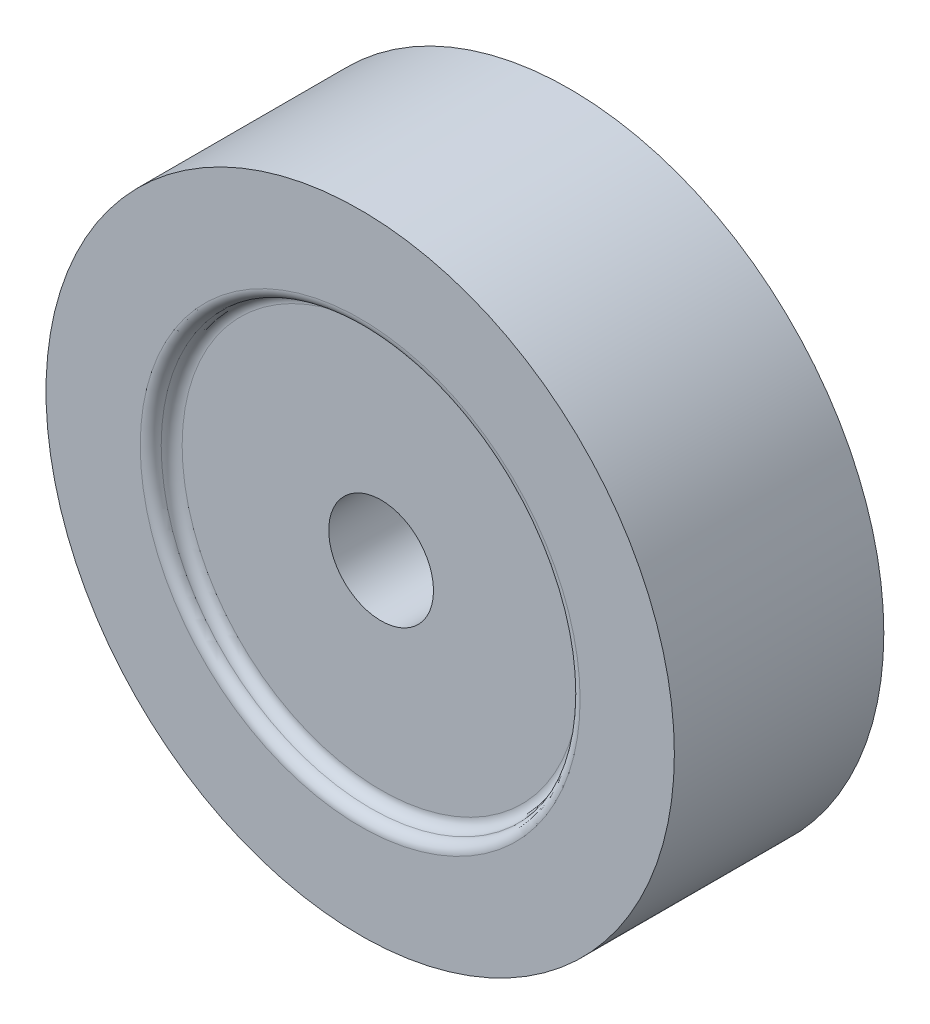
ISO-10303-21;
HEADER;
FILE_DESCRIPTION(('STEP AP214'),'2;1');
FILE_NAME('part.step','',(''),(''),'','','');
FILE_SCHEMA(('AUTOMOTIVE_DESIGN { 1 0 10303 214 1 1 1 1 }'));
ENDSEC;
DATA;
#1=APPLICATION_CONTEXT('core data for automotive mechanical design processes');
#2=APPLICATION_PROTOCOL_DEFINITION('international standard','automotive_design',2000,#1);
#3=PRODUCT_CONTEXT('',#1,'mechanical');
#4=PRODUCT('Part','Part','',(#3));
#5=PRODUCT_RELATED_PRODUCT_CATEGORY('part','',(#4));
#6=PRODUCT_DEFINITION_FORMATION('','',#4);
#7=PRODUCT_DEFINITION_CONTEXT('part definition',#1,'design');
#8=PRODUCT_DEFINITION('design','',#6,#7);
#9=PRODUCT_DEFINITION_SHAPE('','',#8);
#10=(LENGTH_UNIT() NAMED_UNIT(*) SI_UNIT(.MILLI.,.METRE.));
#11=(NAMED_UNIT(*) PLANE_ANGLE_UNIT() SI_UNIT($,.RADIAN.));
#12=(NAMED_UNIT(*) SI_UNIT($,.STERADIAN.) SOLID_ANGLE_UNIT());
#13=UNCERTAINTY_MEASURE_WITH_UNIT(LENGTH_MEASURE(1.E-05),#10,'distance_accuracy_value','');
#14=(GEOMETRIC_REPRESENTATION_CONTEXT(3) GLOBAL_UNCERTAINTY_ASSIGNED_CONTEXT((#13)) GLOBAL_UNIT_ASSIGNED_CONTEXT((#10,
#11,#12)) REPRESENTATION_CONTEXT('',''));
#15=CARTESIAN_POINT('',(0.,0.,0.));
#16=DIRECTION('',(0.,0.,1.));
#17=DIRECTION('',(1.,0.,0.));
#18=AXIS2_PLACEMENT_3D('',#15,#16,#17);
#19=CARTESIAN_POINT('',(0.,0.,10.));
#20=DIRECTION('',(0.,0.,-1.));
#21=DIRECTION('',(-1.,0.,0.));
#22=AXIS2_PLACEMENT_3D('',#19,#20,#21);
#23=CYLINDRICAL_SURFACE('',#22,30.);
#24=CARTESIAN_POINT('',(0.,0.,10.));
#25=DIRECTION('',(0.,0.,1.));
#26=DIRECTION('',(1.,0.,0.));
#27=AXIS2_PLACEMENT_3D('',#24,#25,#26);
#28=CIRCLE('',#27,30.);
#29=CARTESIAN_POINT('',(30.,0.,10.));
#30=VERTEX_POINT('',#29);
#31=EDGE_CURVE('E54',#30,#30,#28,.T.);
#32=ORIENTED_EDGE('',*,*,#31,.F.);
#33=EDGE_LOOP('',(#32));
#34=FACE_BOUND('',#33,.T.);
#35=CARTESIAN_POINT('',(0.,0.,-10.));
#36=DIRECTION('',(0.,0.,1.));
#37=DIRECTION('',(1.,0.,0.));
#38=AXIS2_PLACEMENT_3D('',#35,#36,#37);
#39=CIRCLE('',#38,30.);
#40=CARTESIAN_POINT('',(30.,0.,-10.));
#41=VERTEX_POINT('',#40);
#42=EDGE_CURVE('E50',#41,#41,#39,.T.);
#43=ORIENTED_EDGE('',*,*,#42,.T.);
#44=EDGE_LOOP('',(#43));
#45=FACE_BOUND('',#44,.T.);
#46=ADVANCED_FACE('F32',(#34,#45),#23,.T.);
#47=CARTESIAN_POINT('',(0.,0.,10.));
#48=DIRECTION('',(0.,0.,1.));
#49=DIRECTION('',(1.,0.,0.));
#50=AXIS2_PLACEMENT_3D('',#47,#48,#49);
#51=PLANE('',#50);
#52=CARTESIAN_POINT('',(0.,0.,10.));
#53=DIRECTION('',(0.,0.,1.));
#54=DIRECTION('',(1.,0.,0.));
#55=AXIS2_PLACEMENT_3D('',#52,#53,#54);
#56=CIRCLE('',#55,21.);
#57=CARTESIAN_POINT('',(21.,0.,10.));
#58=VERTEX_POINT('',#57);
#59=EDGE_CURVE('E45',#58,#58,#56,.F.);
#60=ORIENTED_EDGE('',*,*,#59,.T.);
#61=EDGE_LOOP('',(#60));
#62=FACE_BOUND('',#61,.T.);
#63=ORIENTED_EDGE('',*,*,#31,.T.);
#64=EDGE_LOOP('',(#63));
#65=FACE_BOUND('',#64,.T.);
#66=ADVANCED_FACE('F75',(#62,#65),#51,.T.);
#67=CARTESIAN_POINT('',(0.,0.,-10.));
#68=DIRECTION('',(0.,0.,1.));
#69=DIRECTION('',(1.,0.,0.));
#70=AXIS2_PLACEMENT_3D('',#67,#68,#69);
#71=PLANE('',#70);
#72=CARTESIAN_POINT('',(0.,0.,-10.));
#73=DIRECTION('',(0.,0.,1.));
#74=DIRECTION('',(1.,0.,0.));
#75=AXIS2_PLACEMENT_3D('',#72,#73,#74);
#76=CIRCLE('',#75,21.);
#77=CARTESIAN_POINT('',(21.,0.,-10.));
#78=VERTEX_POINT('',#77);
#79=EDGE_CURVE('E10',#78,#78,#76,.T.);
#80=ORIENTED_EDGE('',*,*,#79,.T.);
#81=EDGE_LOOP('',(#80));
#82=FACE_BOUND('',#81,.T.);
#83=ORIENTED_EDGE('',*,*,#42,.F.);
#84=EDGE_LOOP('',(#83));
#85=FACE_BOUND('',#84,.T.);
#86=ADVANCED_FACE('F98',(#82,#85),#71,.F.);
#87=CARTESIAN_POINT('',(0.,0.,8.));
#88=DIRECTION('',(0.,0.,1.));
#89=DIRECTION('',(1.,0.,0.));
#90=AXIS2_PLACEMENT_3D('',#87,#88,#89);
#91=PLANE('',#90);
#92=CARTESIAN_POINT('',(0.,0.,8.));
#93=DIRECTION('',(0.,0.,1.));
#94=DIRECTION('',(1.,0.,0.));
#95=AXIS2_PLACEMENT_3D('',#92,#93,#94);
#96=CIRCLE('',#95,5.);
#97=CARTESIAN_POINT('',(5.,0.,8.));
#98=VERTEX_POINT('',#97);
#99=EDGE_CURVE('E57',#98,#98,#96,.T.);
#100=ORIENTED_EDGE('',*,*,#99,.F.);
#101=EDGE_LOOP('',(#100));
#102=FACE_BOUND('',#101,.T.);
#103=CARTESIAN_POINT('',(0.,0.,8.));
#104=DIRECTION('',(0.,0.,1.));
#105=DIRECTION('',(1.,0.,0.));
#106=AXIS2_PLACEMENT_3D('',#103,#104,#105);
#107=CIRCLE('',#106,19.);
#108=CARTESIAN_POINT('',(19.,0.,8.));
#109=VERTEX_POINT('',#108);
#110=EDGE_CURVE('E69',#109,#109,#107,.T.);
#111=ORIENTED_EDGE('',*,*,#110,.T.);
#112=EDGE_LOOP('',(#111));
#113=FACE_BOUND('',#112,.T.);
#114=ADVANCED_FACE('F89',(#102,#113),#91,.T.);
#115=CARTESIAN_POINT('',(0.,0.,-8.));
#116=DIRECTION('',(0.,0.,-1.));
#117=DIRECTION('',(1.,0.,0.));
#118=AXIS2_PLACEMENT_3D('',#115,#116,#117);
#119=PLANE('',#118);
#120=CARTESIAN_POINT('',(0.,0.,-8.));
#121=DIRECTION('',(0.,0.,-1.));
#122=DIRECTION('',(-1.,0.,0.));
#123=AXIS2_PLACEMENT_3D('',#120,#121,#122);
#124=CIRCLE('',#123,5.);
#125=CARTESIAN_POINT('',(-5.,0.,-8.));
#126=VERTEX_POINT('',#125);
#127=EDGE_CURVE('E61',#126,#126,#124,.F.);
#128=ORIENTED_EDGE('',*,*,#127,.T.);
#129=EDGE_LOOP('',(#128));
#130=FACE_BOUND('',#129,.T.);
#131=CARTESIAN_POINT('',(0.,0.,-8.));
#132=DIRECTION('',(0.,0.,-1.));
#133=DIRECTION('',(-1.,0.,0.));
#134=AXIS2_PLACEMENT_3D('',#131,#132,#133);
#135=CIRCLE('',#134,19.);
#136=CARTESIAN_POINT('',(-19.,0.,-8.));
#137=VERTEX_POINT('',#136);
#138=EDGE_CURVE('E40',#137,#137,#135,.T.);
#139=ORIENTED_EDGE('',*,*,#138,.T.);
#140=EDGE_LOOP('',(#139));
#141=FACE_BOUND('',#140,.T.);
#142=ADVANCED_FACE('F82',(#130,#141),#119,.T.);
#143=CARTESIAN_POINT('',(0.,0.,9.));
#144=DIRECTION('',(0.,0.,1.));
#145=DIRECTION('',(1.,0.,0.));
#146=AXIS2_PLACEMENT_3D('',#143,#144,#145);
#147=TOROIDAL_SURFACE('',#146,21.,1.);
#148=ORIENTED_EDGE('',*,*,#59,.F.);
#149=EDGE_LOOP('',(#148));
#150=FACE_BOUND('',#149,.T.);
#151=CARTESIAN_POINT('',(0.,0.,9.));
#152=DIRECTION('',(0.,0.,1.));
#153=DIRECTION('',(1.,0.,0.));
#154=AXIS2_PLACEMENT_3D('',#151,#152,#153);
#155=CIRCLE('',#154,20.);
#156=CARTESIAN_POINT('',(20.,0.,9.));
#157=VERTEX_POINT('',#156);
#158=EDGE_CURVE('E48',#157,#157,#155,.T.);
#159=ORIENTED_EDGE('',*,*,#158,.F.);
#160=EDGE_LOOP('',(#159));
#161=FACE_BOUND('',#160,.T.);
#162=ADVANCED_FACE('F78',(#150,#161),#147,.T.);
#163=CARTESIAN_POINT('',(0.,0.,9.));
#164=DIRECTION('',(0.,0.,1.));
#165=DIRECTION('',(1.,0.,0.));
#166=AXIS2_PLACEMENT_3D('',#163,#164,#165);
#167=TOROIDAL_SURFACE('',#166,19.,1.);
#168=ORIENTED_EDGE('',*,*,#158,.T.);
#169=EDGE_LOOP('',(#168));
#170=FACE_BOUND('',#169,.T.);
#171=ORIENTED_EDGE('',*,*,#110,.F.);
#172=EDGE_LOOP('',(#171));
#173=FACE_BOUND('',#172,.T.);
#174=ADVANCED_FACE('F81',(#170,#173),#167,.F.);
#175=CARTESIAN_POINT('',(0.,0.,-9.));
#176=DIRECTION('',(0.,0.,1.));
#177=DIRECTION('',(1.,0.,0.));
#178=AXIS2_PLACEMENT_3D('',#175,#176,#177);
#179=TOROIDAL_SURFACE('',#178,21.,1.);
#180=ORIENTED_EDGE('',*,*,#79,.F.);
#181=EDGE_LOOP('',(#180));
#182=FACE_BOUND('',#181,.T.);
#183=CARTESIAN_POINT('',(0.,0.,-9.));
#184=DIRECTION('',(0.,0.,1.));
#185=DIRECTION('',(1.,0.,0.));
#186=AXIS2_PLACEMENT_3D('',#183,#184,#185);
#187=CIRCLE('',#186,20.);
#188=CARTESIAN_POINT('',(20.,0.,-9.));
#189=VERTEX_POINT('',#188);
#190=EDGE_CURVE('E36',#189,#189,#187,.F.);
#191=ORIENTED_EDGE('',*,*,#190,.F.);
#192=EDGE_LOOP('',(#191));
#193=FACE_BOUND('',#192,.T.);
#194=ADVANCED_FACE('F34',(#182,#193),#179,.T.);
#195=CARTESIAN_POINT('',(0.,0.,-9.));
#196=DIRECTION('',(0.,0.,-1.));
#197=DIRECTION('',(-1.,0.,0.));
#198=AXIS2_PLACEMENT_3D('',#195,#196,#197);
#199=TOROIDAL_SURFACE('',#198,19.,1.);
#200=ORIENTED_EDGE('',*,*,#138,.F.);
#201=EDGE_LOOP('',(#200));
#202=FACE_BOUND('',#201,.T.);
#203=ORIENTED_EDGE('',*,*,#190,.T.);
#204=EDGE_LOOP('',(#203));
#205=FACE_BOUND('',#204,.T.);
#206=ADVANCED_FACE('F110',(#202,#205),#199,.F.);
#207=CARTESIAN_POINT('',(0.,0.,-10.001));
#208=DIRECTION('',(0.,0.,1.));
#209=DIRECTION('',(1.,0.,0.));
#210=AXIS2_PLACEMENT_3D('',#207,#208,#209);
#211=CYLINDRICAL_SURFACE('',#210,5.);
#212=ORIENTED_EDGE('',*,*,#127,.F.);
#213=EDGE_LOOP('',(#212));
#214=FACE_BOUND('',#213,.T.);
#215=ORIENTED_EDGE('',*,*,#99,.T.);
#216=EDGE_LOOP('',(#215));
#217=FACE_BOUND('',#216,.T.);
#218=ADVANCED_FACE('F108',(#214,#217),#211,.F.);
#219=CLOSED_SHELL('',(#46,#66,#86,#114,#142,#162,#174,#194,#206,#218));
#220=MANIFOLD_SOLID_BREP('B2',#219);
#221=ADVANCED_BREP_SHAPE_REPRESENTATION('',(#18,#220),#14);
#222=SHAPE_DEFINITION_REPRESENTATION(#9,#221);
ENDSEC;
END-ISO-10303-21;
